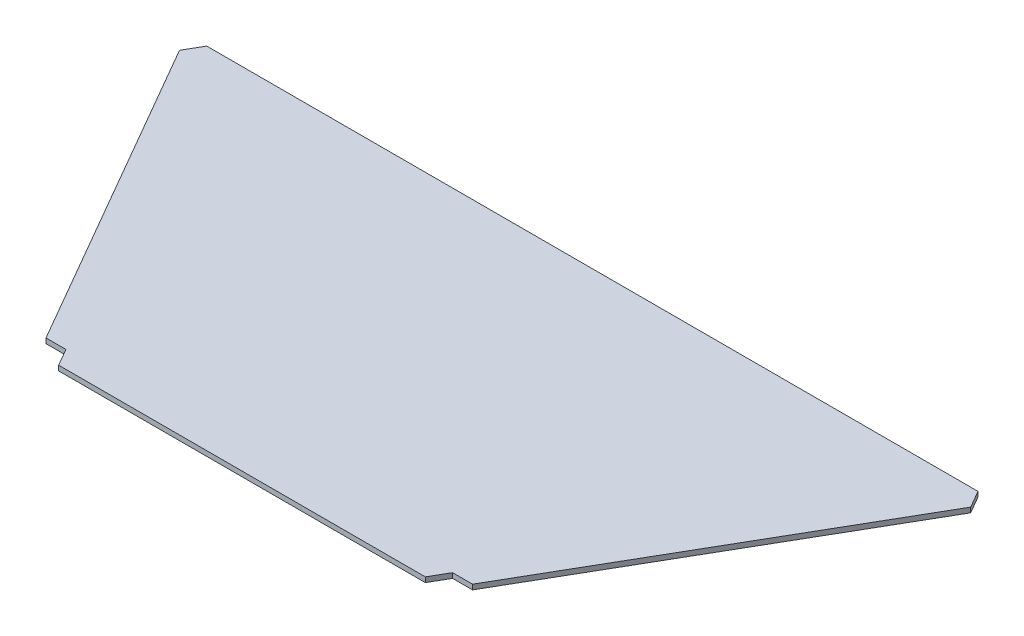
ISO-10303-21;
HEADER;
FILE_DESCRIPTION(('STEP AP214'),'2;1');
FILE_NAME('part.step','',(''),(''),'','','');
FILE_SCHEMA(('AUTOMOTIVE_DESIGN { 1 0 10303 214 1 1 1 1 }'));
ENDSEC;
DATA;
#1=APPLICATION_CONTEXT('core data for automotive mechanical design processes');
#2=APPLICATION_PROTOCOL_DEFINITION('international standard','automotive_design',2000,#1);
#3=PRODUCT_CONTEXT('',#1,'mechanical');
#4=PRODUCT('Part','Part','',(#3));
#5=PRODUCT_RELATED_PRODUCT_CATEGORY('part','',(#4));
#6=PRODUCT_DEFINITION_FORMATION('','',#4);
#7=PRODUCT_DEFINITION_CONTEXT('part definition',#1,'design');
#8=PRODUCT_DEFINITION('design','',#6,#7);
#9=PRODUCT_DEFINITION_SHAPE('','',#8);
#10=(LENGTH_UNIT() NAMED_UNIT(*) SI_UNIT(.MILLI.,.METRE.));
#11=(NAMED_UNIT(*) PLANE_ANGLE_UNIT() SI_UNIT($,.RADIAN.));
#12=(NAMED_UNIT(*) SI_UNIT($,.STERADIAN.) SOLID_ANGLE_UNIT());
#13=UNCERTAINTY_MEASURE_WITH_UNIT(LENGTH_MEASURE(1.E-05),#10,'distance_accuracy_value','');
#14=(GEOMETRIC_REPRESENTATION_CONTEXT(3) GLOBAL_UNCERTAINTY_ASSIGNED_CONTEXT((#13)) GLOBAL_UNIT_ASSIGNED_CONTEXT((#10,
#11,#12)) REPRESENTATION_CONTEXT('',''));
#15=CARTESIAN_POINT('',(0.,0.,0.));
#16=DIRECTION('',(0.,0.,1.));
#17=DIRECTION('',(1.,0.,0.));
#18=AXIS2_PLACEMENT_3D('',#15,#16,#17);
#19=CARTESIAN_POINT('',(0.,12.7,0.));
#20=DIRECTION('',(0.,1.,0.));
#21=DIRECTION('',(0.,0.,1.));
#22=AXIS2_PLACEMENT_3D('',#19,#20,#21);
#23=PLANE('',#22);
#24=DIRECTION('',(0.500000000000017,0.,0.866025403784429));
#25=VECTOR('',#24,1.);
#26=CARTESIAN_POINT('',(981.90774863168,12.7,4.35229));
#27=LINE('',#26,#25);
#28=CARTESIAN_POINT('',(1007.30774863165,12.7,48.3463805121911));
#29=VERTEX_POINT('',#28);
#30=CARTESIAN_POINT('',(981.90774863168,12.7,4.35229));
#31=VERTEX_POINT('',#30);
#32=EDGE_CURVE('E97',#29,#31,#27,.F.);
#33=ORIENTED_EDGE('',*,*,#32,.T.);
#34=DIRECTION('',(-1.,0.,0.));
#35=VECTOR('',#34,1.);
#36=CARTESIAN_POINT('',(1032.70774863168,12.7,4.35229));
#37=LINE('',#36,#35);
#38=CARTESIAN_POINT('',(-981.907748631679,12.7,4.35229000000032));
#39=VERTEX_POINT('',#38);
#40=EDGE_CURVE('E19',#39,#31,#37,.F.);
#41=ORIENTED_EDGE('',*,*,#40,.F.);
#42=DIRECTION('',(0.500000000000017,0.,-0.866025403784429));
#43=VECTOR('',#42,1.);
#44=CARTESIAN_POINT('',(-1007.30774863168,12.7,48.3463805122526));
#45=LINE('',#44,#43);
#46=CARTESIAN_POINT('',(-1007.30774863168,12.7,48.3463805122523));
#47=VERTEX_POINT('',#46);
#48=EDGE_CURVE('E95',#39,#47,#45,.F.);
#49=ORIENTED_EDGE('',*,*,#48,.T.);
#50=DIRECTION('',(0.500000000000017,0.,0.866025403784429));
#51=VECTOR('',#50,1.);
#52=CARTESIAN_POINT('',(-1032.70774863168,12.7,4.35229));
#53=LINE('',#52,#51);
#54=CARTESIAN_POINT('',(-543.010272217354,12.7,852.533199487745));
#55=VERTEX_POINT('',#54);
#56=EDGE_CURVE('E89',#55,#47,#53,.F.);
#57=ORIENTED_EDGE('',*,*,#56,.F.);
#58=DIRECTION('',(-1.,0.,0.));
#59=VECTOR('',#58,1.);
#60=CARTESIAN_POINT('',(-492.210272217314,12.7,852.533199487722));
#61=LINE('',#60,#59);
#62=CARTESIAN_POINT('',(-492.210272217317,12.7,852.533199487724));
#63=VERTEX_POINT('',#62);
#64=EDGE_CURVE('E117',#55,#63,#61,.F.);
#65=ORIENTED_EDGE('',*,*,#64,.T.);
#66=DIRECTION('',(-0.500000000000017,0.,-0.866025403784429));
#67=VECTOR('',#66,1.);
#68=CARTESIAN_POINT('',(-466.810272217314,12.7,896.52729));
#69=LINE('',#68,#67);
#70=CARTESIAN_POINT('',(-466.810272217314,12.7,896.52729));
#71=VERTEX_POINT('',#70);
#72=EDGE_CURVE('E122',#63,#71,#69,.F.);
#73=ORIENTED_EDGE('',*,*,#72,.T.);
#74=DIRECTION('',(1.,0.,0.));
#75=VECTOR('',#74,1.);
#76=CARTESIAN_POINT('',(-517.610272217314,12.7,896.52729));
#77=LINE('',#76,#75);
#78=CARTESIAN_POINT('',(466.810272217311,12.7,896.527289999998));
#79=VERTEX_POINT('',#78);
#80=EDGE_CURVE('E125',#79,#71,#77,.F.);
#81=ORIENTED_EDGE('',*,*,#80,.F.);
#82=DIRECTION('',(-0.500000000000017,0.,0.866025403784429));
#83=VECTOR('',#82,1.);
#84=CARTESIAN_POINT('',(492.210272217314,12.7,852.533199487722));
#85=LINE('',#84,#83);
#86=CARTESIAN_POINT('',(492.210272217314,12.7,852.533199487722));
#87=VERTEX_POINT('',#86);
#88=EDGE_CURVE('E132',#79,#87,#85,.F.);
#89=ORIENTED_EDGE('',*,*,#88,.T.);
#90=DIRECTION('',(-1.,0.,0.));
#91=VECTOR('',#90,1.);
#92=CARTESIAN_POINT('',(543.010272217314,12.7,852.533199487722));
#93=LINE('',#92,#91);
#94=CARTESIAN_POINT('',(543.010272217317,12.7,852.533199487724));
#95=VERTEX_POINT('',#94);
#96=EDGE_CURVE('E137',#87,#95,#93,.F.);
#97=ORIENTED_EDGE('',*,*,#96,.T.);
#98=DIRECTION('',(0.500000000000017,0.,-0.866025403784429));
#99=VECTOR('',#98,1.);
#100=CARTESIAN_POINT('',(517.610272217314,12.7,896.52729));
#101=LINE('',#100,#99);
#102=EDGE_CURVE('E140',#29,#95,#101,.F.);
#103=ORIENTED_EDGE('',*,*,#102,.F.);
#104=EDGE_LOOP('',(#33,#41,#49,#57,#65,#73,#81,#89,#97,#103));
#105=FACE_BOUND('',#104,.T.);
#106=ADVANCED_FACE('F16',(#105),#23,.T.);
#107=CARTESIAN_POINT('',(1032.70774863168,0.,4.35229));
#108=DIRECTION('',(0.,0.,-1.));
#109=DIRECTION('',(-1.,0.,0.));
#110=AXIS2_PLACEMENT_3D('',#107,#108,#109);
#111=PLANE('',#110);
#112=DIRECTION('',(0.,1.,0.));
#113=VECTOR('',#112,1.);
#114=CARTESIAN_POINT('',(981.90774863168,12.7,4.35229));
#115=LINE('',#114,#113);
#116=CARTESIAN_POINT('',(981.90774863168,0.,4.35228999999998));
#117=VERTEX_POINT('',#116);
#118=EDGE_CURVE('E146',#31,#117,#115,.F.);
#119=ORIENTED_EDGE('',*,*,#118,.T.);
#120=DIRECTION('',(1.,0.,0.));
#121=VECTOR('',#120,1.);
#122=CARTESIAN_POINT('',(0.,0.,4.35229));
#123=LINE('',#122,#121);
#124=CARTESIAN_POINT('',(-981.907748631679,0.,4.35229000000032));
#125=VERTEX_POINT('',#124);
#126=EDGE_CURVE('E111',#117,#125,#123,.F.);
#127=ORIENTED_EDGE('',*,*,#126,.T.);
#128=DIRECTION('',(0.,1.,0.));
#129=VECTOR('',#128,1.);
#130=CARTESIAN_POINT('',(-981.907748631678,12.7,4.35229000000127));
#131=LINE('',#130,#129);
#132=EDGE_CURVE('E102',#125,#39,#131,.T.);
#133=ORIENTED_EDGE('',*,*,#132,.T.);
#134=ORIENTED_EDGE('',*,*,#40,.T.);
#135=EDGE_LOOP('',(#119,#127,#133,#134));
#136=FACE_BOUND('',#135,.T.);
#137=ADVANCED_FACE('F110',(#136),#111,.T.);
#138=CARTESIAN_POINT('',(-1007.30774863168,12.7,48.3463805122526));
#139=DIRECTION('',(0.866025403784429,0.,0.500000000000017));
#140=DIRECTION('',(0.500000000000017,0.,-0.866025403784429));
#141=AXIS2_PLACEMENT_3D('',#138,#139,#140);
#142=PLANE('',#141);
#143=ORIENTED_EDGE('',*,*,#48,.F.);
#144=ORIENTED_EDGE('',*,*,#132,.F.);
#145=DIRECTION('',(-0.499999999999973,0.,0.866025403784454));
#146=VECTOR('',#145,1.);
#147=CARTESIAN_POINT('',(-981.90774863168,0.,4.35229));
#148=LINE('',#147,#146);
#149=CARTESIAN_POINT('',(-1007.30774863168,0.,48.3463805122523));
#150=VERTEX_POINT('',#149);
#151=EDGE_CURVE('E149',#125,#150,#148,.T.);
#152=ORIENTED_EDGE('',*,*,#151,.T.);
#153=DIRECTION('',(0.,1.,0.));
#154=VECTOR('',#153,1.);
#155=CARTESIAN_POINT('',(-1007.30774863168,0.,48.3463805122514));
#156=LINE('',#155,#154);
#157=EDGE_CURVE('E107',#47,#150,#156,.F.);
#158=ORIENTED_EDGE('',*,*,#157,.F.);
#159=EDGE_LOOP('',(#143,#144,#152,#158));
#160=FACE_BOUND('',#159,.T.);
#161=ADVANCED_FACE('F104',(#160),#142,.F.);
#162=CARTESIAN_POINT('',(-1032.70774863168,0.,4.35229));
#163=DIRECTION('',(-0.866025403784429,0.,0.500000000000017));
#164=DIRECTION('',(0.500000000000017,0.,0.866025403784429));
#165=AXIS2_PLACEMENT_3D('',#162,#163,#164);
#166=PLANE('',#165);
#167=ORIENTED_EDGE('',*,*,#157,.T.);
#168=DIRECTION('',(0.500000000000105,0.,0.866025403784378));
#169=VECTOR('',#168,1.);
#170=CARTESIAN_POINT('',(-1007.30774863168,0.,48.3463805122526));
#171=LINE('',#170,#169);
#172=CARTESIAN_POINT('',(-543.010272217354,0.,852.533199487745));
#173=VERTEX_POINT('',#172);
#174=EDGE_CURVE('E151',#150,#173,#171,.T.);
#175=ORIENTED_EDGE('',*,*,#174,.T.);
#176=DIRECTION('',(0.,1.,0.));
#177=VECTOR('',#176,1.);
#178=CARTESIAN_POINT('',(-543.010272217314,12.7,852.533199487722));
#179=LINE('',#178,#177);
#180=EDGE_CURVE('E115',#173,#55,#179,.T.);
#181=ORIENTED_EDGE('',*,*,#180,.T.);
#182=ORIENTED_EDGE('',*,*,#56,.T.);
#183=EDGE_LOOP('',(#167,#175,#181,#182));
#184=FACE_BOUND('',#183,.T.);
#185=ADVANCED_FACE('F197',(#184),#166,.T.);
#186=CARTESIAN_POINT('',(-492.210272217314,12.7,852.533199487722));
#187=DIRECTION('',(0.,0.,-1.));
#188=DIRECTION('',(-1.,0.,0.));
#189=AXIS2_PLACEMENT_3D('',#186,#187,#188);
#190=PLANE('',#189);
#191=ORIENTED_EDGE('',*,*,#64,.F.);
#192=ORIENTED_EDGE('',*,*,#180,.F.);
#193=DIRECTION('',(1.,0.,0.));
#194=VECTOR('',#193,1.);
#195=CARTESIAN_POINT('',(0.,0.,852.533199487722));
#196=LINE('',#195,#194);
#197=CARTESIAN_POINT('',(-492.210272217317,0.,852.533199487724));
#198=VERTEX_POINT('',#197);
#199=EDGE_CURVE('E154',#173,#198,#196,.T.);
#200=ORIENTED_EDGE('',*,*,#199,.T.);
#201=DIRECTION('',(0.,1.,0.));
#202=VECTOR('',#201,1.);
#203=CARTESIAN_POINT('',(-492.210272217327,12.7,852.53319948773));
#204=LINE('',#203,#202);
#205=EDGE_CURVE('E119',#198,#63,#204,.T.);
#206=ORIENTED_EDGE('',*,*,#205,.T.);
#207=EDGE_LOOP('',(#191,#192,#200,#206));
#208=FACE_BOUND('',#207,.T.);
#209=ADVANCED_FACE('F196',(#208),#190,.F.);
#210=CARTESIAN_POINT('',(-466.810272217314,12.7,896.52729));
#211=DIRECTION('',(0.866025403784429,0.,-0.500000000000017));
#212=DIRECTION('',(-0.500000000000017,0.,-0.866025403784429));
#213=AXIS2_PLACEMENT_3D('',#210,#211,#212);
#214=PLANE('',#213);
#215=ORIENTED_EDGE('',*,*,#72,.F.);
#216=ORIENTED_EDGE('',*,*,#205,.F.);
#217=DIRECTION('',(0.499999999999758,0.,0.866025403784578));
#218=VECTOR('',#217,1.);
#219=CARTESIAN_POINT('',(-492.210272217314,0.,852.533199487722));
#220=LINE('',#219,#218);
#221=CARTESIAN_POINT('',(-466.810272217314,0.,896.52729));
#222=VERTEX_POINT('',#221);
#223=EDGE_CURVE('E157',#198,#222,#220,.T.);
#224=ORIENTED_EDGE('',*,*,#223,.T.);
#225=DIRECTION('',(0.,1.,0.));
#226=VECTOR('',#225,1.);
#227=CARTESIAN_POINT('',(-466.810272217314,0.,896.52729));
#228=LINE('',#227,#226);
#229=EDGE_CURVE('E127',#71,#222,#228,.F.);
#230=ORIENTED_EDGE('',*,*,#229,.F.);
#231=EDGE_LOOP('',(#215,#216,#224,#230));
#232=FACE_BOUND('',#231,.T.);
#233=ADVANCED_FACE('F191',(#232),#214,.F.);
#234=CARTESIAN_POINT('',(-517.610272217314,0.,896.52729));
#235=DIRECTION('',(0.,0.,1.));
#236=DIRECTION('',(1.,0.,0.));
#237=AXIS2_PLACEMENT_3D('',#234,#235,#236);
#238=PLANE('',#237);
#239=ORIENTED_EDGE('',*,*,#229,.T.);
#240=DIRECTION('',(1.,0.,0.));
#241=VECTOR('',#240,1.);
#242=CARTESIAN_POINT('',(0.,0.,896.52729));
#243=LINE('',#242,#241);
#244=CARTESIAN_POINT('',(466.810272217311,0.,896.527289999998));
#245=VERTEX_POINT('',#244);
#246=EDGE_CURVE('E160',#222,#245,#243,.T.);
#247=ORIENTED_EDGE('',*,*,#246,.T.);
#248=DIRECTION('',(0.,1.,0.));
#249=VECTOR('',#248,1.);
#250=CARTESIAN_POINT('',(466.810272217301,12.7,896.527289999992));
#251=LINE('',#250,#249);
#252=EDGE_CURVE('E129',#245,#79,#251,.T.);
#253=ORIENTED_EDGE('',*,*,#252,.T.);
#254=ORIENTED_EDGE('',*,*,#80,.T.);
#255=EDGE_LOOP('',(#239,#247,#253,#254));
#256=FACE_BOUND('',#255,.T.);
#257=ADVANCED_FACE('F187',(#256),#238,.T.);
#258=CARTESIAN_POINT('',(492.210272217314,12.7,852.533199487722));
#259=DIRECTION('',(-0.866025403784429,0.,-0.500000000000017));
#260=DIRECTION('',(-0.500000000000017,0.,0.866025403784429));
#261=AXIS2_PLACEMENT_3D('',#258,#259,#260);
#262=PLANE('',#261);
#263=ORIENTED_EDGE('',*,*,#88,.F.);
#264=ORIENTED_EDGE('',*,*,#252,.F.);
#265=DIRECTION('',(0.499999999999758,0.,-0.866025403784578));
#266=VECTOR('',#265,1.);
#267=CARTESIAN_POINT('',(466.810272217314,0.,896.52729));
#268=LINE('',#267,#266);
#269=CARTESIAN_POINT('',(492.210272217314,0.,852.533199487722));
#270=VERTEX_POINT('',#269);
#271=EDGE_CURVE('E163',#245,#270,#268,.T.);
#272=ORIENTED_EDGE('',*,*,#271,.T.);
#273=DIRECTION('',(0.,1.,0.));
#274=VECTOR('',#273,1.);
#275=CARTESIAN_POINT('',(492.210272217314,12.7,852.533199487722));
#276=LINE('',#275,#274);
#277=EDGE_CURVE('E134',#270,#87,#276,.T.);
#278=ORIENTED_EDGE('',*,*,#277,.T.);
#279=EDGE_LOOP('',(#263,#264,#272,#278));
#280=FACE_BOUND('',#279,.T.);
#281=ADVANCED_FACE('F183',(#280),#262,.F.);
#282=CARTESIAN_POINT('',(543.010272217314,12.7,852.533199487722));
#283=DIRECTION('',(0.,0.,-1.));
#284=DIRECTION('',(-1.,0.,0.));
#285=AXIS2_PLACEMENT_3D('',#282,#283,#284);
#286=PLANE('',#285);
#287=ORIENTED_EDGE('',*,*,#96,.F.);
#288=ORIENTED_EDGE('',*,*,#277,.F.);
#289=DIRECTION('',(1.,0.,0.));
#290=VECTOR('',#289,1.);
#291=CARTESIAN_POINT('',(0.,0.,852.533199487722));
#292=LINE('',#291,#290);
#293=CARTESIAN_POINT('',(543.010272217317,0.,852.533199487724));
#294=VERTEX_POINT('',#293);
#295=EDGE_CURVE('E166',#270,#294,#292,.T.);
#296=ORIENTED_EDGE('',*,*,#295,.T.);
#297=DIRECTION('',(0.,1.,0.));
#298=VECTOR('',#297,1.);
#299=CARTESIAN_POINT('',(543.010272217327,0.,852.53319948773));
#300=LINE('',#299,#298);
#301=EDGE_CURVE('E142',#95,#294,#300,.F.);
#302=ORIENTED_EDGE('',*,*,#301,.F.);
#303=EDGE_LOOP('',(#287,#288,#296,#302));
#304=FACE_BOUND('',#303,.T.);
#305=ADVANCED_FACE('F180',(#304),#286,.F.);
#306=CARTESIAN_POINT('',(517.610272217314,0.,896.52729));
#307=DIRECTION('',(0.866025403784429,0.,0.500000000000017));
#308=DIRECTION('',(0.500000000000017,0.,-0.866025403784429));
#309=AXIS2_PLACEMENT_3D('',#306,#307,#308);
#310=PLANE('',#309);
#311=ORIENTED_EDGE('',*,*,#301,.T.);
#312=DIRECTION('',(0.500000000000081,0.,-0.866025403784392));
#313=VECTOR('',#312,1.);
#314=CARTESIAN_POINT('',(543.010272217314,0.,852.533199487722));
#315=LINE('',#314,#313);
#316=CARTESIAN_POINT('',(1007.30774863165,0.,48.3463805121911));
#317=VERTEX_POINT('',#316);
#318=EDGE_CURVE('E25',#294,#317,#315,.T.);
#319=ORIENTED_EDGE('',*,*,#318,.T.);
#320=DIRECTION('',(0.,1.,0.));
#321=VECTOR('',#320,1.);
#322=CARTESIAN_POINT('',(1007.30774863166,12.7,48.3463805122132));
#323=LINE('',#322,#321);
#324=EDGE_CURVE('E33',#317,#29,#323,.T.);
#325=ORIENTED_EDGE('',*,*,#324,.T.);
#326=ORIENTED_EDGE('',*,*,#102,.T.);
#327=EDGE_LOOP('',(#311,#319,#325,#326));
#328=FACE_BOUND('',#327,.T.);
#329=ADVANCED_FACE('F172',(#328),#310,.T.);
#330=CARTESIAN_POINT('',(981.90774863168,12.7,4.35229));
#331=DIRECTION('',(-0.866025403784429,0.,0.500000000000017));
#332=DIRECTION('',(0.500000000000017,0.,0.866025403784429));
#333=AXIS2_PLACEMENT_3D('',#330,#331,#332);
#334=PLANE('',#333);
#335=ORIENTED_EDGE('',*,*,#32,.F.);
#336=ORIENTED_EDGE('',*,*,#324,.F.);
#337=DIRECTION('',(-0.500000000000406,0.,-0.866025403784204));
#338=VECTOR('',#337,1.);
#339=CARTESIAN_POINT('',(1007.30774863168,0.,48.3463805122018));
#340=LINE('',#339,#338);
#341=EDGE_CURVE('E11',#317,#117,#340,.T.);
#342=ORIENTED_EDGE('',*,*,#341,.T.);
#343=ORIENTED_EDGE('',*,*,#118,.F.);
#344=EDGE_LOOP('',(#335,#336,#342,#343));
#345=FACE_BOUND('',#344,.T.);
#346=ADVANCED_FACE('F198',(#345),#334,.F.);
#347=CARTESIAN_POINT('',(0.,0.,0.));
#348=DIRECTION('',(0.,1.,0.));
#349=DIRECTION('',(0.,0.,1.));
#350=AXIS2_PLACEMENT_3D('',#347,#348,#349);
#351=PLANE('',#350);
#352=ORIENTED_EDGE('',*,*,#318,.F.);
#353=ORIENTED_EDGE('',*,*,#295,.F.);
#354=ORIENTED_EDGE('',*,*,#271,.F.);
#355=ORIENTED_EDGE('',*,*,#246,.F.);
#356=ORIENTED_EDGE('',*,*,#223,.F.);
#357=ORIENTED_EDGE('',*,*,#199,.F.);
#358=ORIENTED_EDGE('',*,*,#174,.F.);
#359=ORIENTED_EDGE('',*,*,#151,.F.);
#360=ORIENTED_EDGE('',*,*,#126,.F.);
#361=ORIENTED_EDGE('',*,*,#341,.F.);
#362=EDGE_LOOP('',(#352,#353,#354,#355,#356,#357,#358,#359,#360,#361));
#363=FACE_BOUND('',#362,.T.);
#364=ADVANCED_FACE('F176',(#363),#351,.F.);
#365=CLOSED_SHELL('',(#106,#137,#161,#185,#209,#233,#257,#281,#305,#329,#346,#364));
#366=MANIFOLD_SOLID_BREP('B1',#365);
#367=ADVANCED_BREP_SHAPE_REPRESENTATION('',(#18,#366),#14);
#368=SHAPE_DEFINITION_REPRESENTATION(#9,#367);
ENDSEC;
END-ISO-10303-21;
